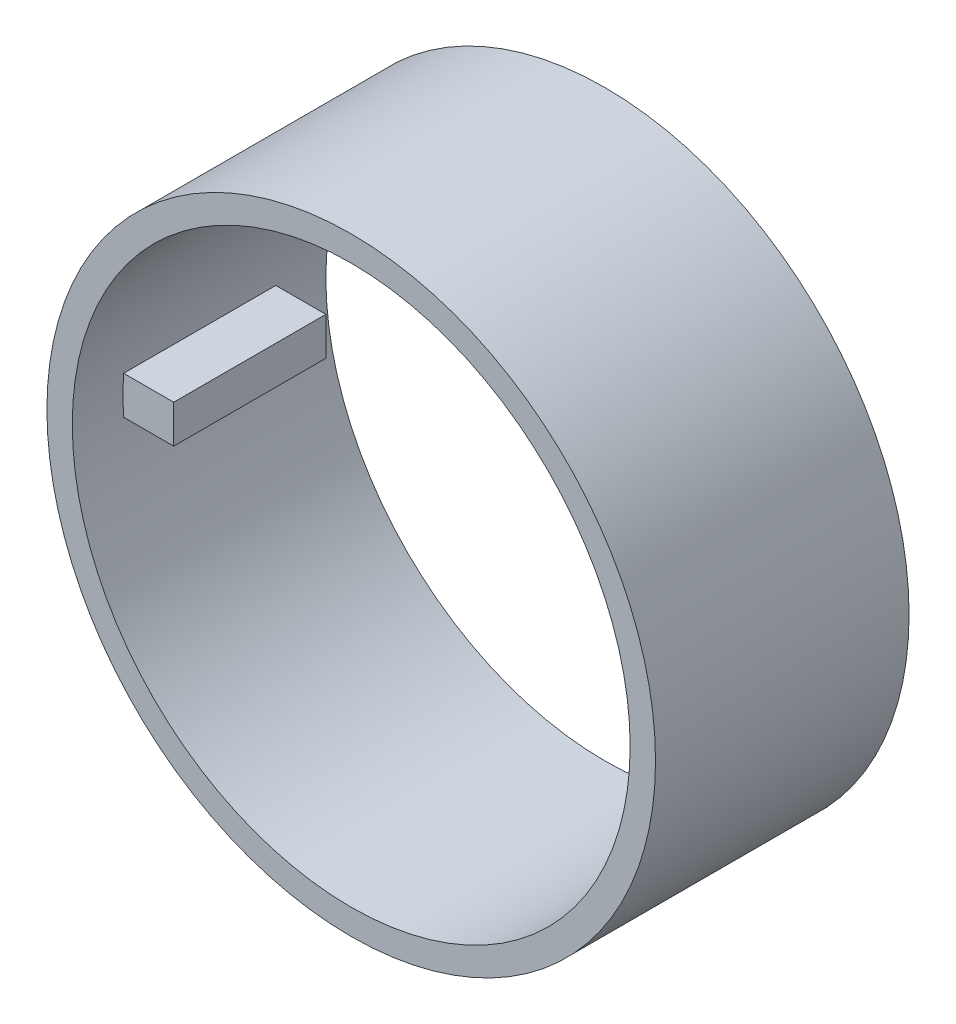
ISO-10303-21;
HEADER;
FILE_DESCRIPTION(('STEP AP214'),'2;1');
FILE_NAME('part.step','',(''),(''),'','','');
FILE_SCHEMA(('AUTOMOTIVE_DESIGN { 1 0 10303 214 1 1 1 1 }'));
ENDSEC;
DATA;
#1=APPLICATION_CONTEXT('core data for automotive mechanical design processes');
#2=APPLICATION_PROTOCOL_DEFINITION('international standard','automotive_design',2000,#1);
#3=PRODUCT_CONTEXT('',#1,'mechanical');
#4=PRODUCT('Part','Part','',(#3));
#5=PRODUCT_RELATED_PRODUCT_CATEGORY('part','',(#4));
#6=PRODUCT_DEFINITION_FORMATION('','',#4);
#7=PRODUCT_DEFINITION_CONTEXT('part definition',#1,'design');
#8=PRODUCT_DEFINITION('design','',#6,#7);
#9=PRODUCT_DEFINITION_SHAPE('','',#8);
#10=(LENGTH_UNIT() NAMED_UNIT(*) SI_UNIT(.MILLI.,.METRE.));
#11=(NAMED_UNIT(*) PLANE_ANGLE_UNIT() SI_UNIT($,.RADIAN.));
#12=(NAMED_UNIT(*) SI_UNIT($,.STERADIAN.) SOLID_ANGLE_UNIT());
#13=UNCERTAINTY_MEASURE_WITH_UNIT(LENGTH_MEASURE(1.E-05),#10,'distance_accuracy_value','');
#14=(GEOMETRIC_REPRESENTATION_CONTEXT(3) GLOBAL_UNCERTAINTY_ASSIGNED_CONTEXT((#13)) GLOBAL_UNIT_ASSIGNED_CONTEXT((#10,
#11,#12)) REPRESENTATION_CONTEXT('',''));
#15=CARTESIAN_POINT('',(0.,0.,0.));
#16=DIRECTION('',(0.,0.,1.));
#17=DIRECTION('',(1.,0.,0.));
#18=AXIS2_PLACEMENT_3D('',#15,#16,#17);
#19=CARTESIAN_POINT('',(0.,0.,63.5));
#20=DIRECTION('',(0.,0.,1.));
#21=DIRECTION('',(1.,0.,0.));
#22=AXIS2_PLACEMENT_3D('',#19,#20,#21);
#23=PLANE('',#22);
#24=CARTESIAN_POINT('',(0.,0.,63.5));
#25=DIRECTION('',(0.,0.,1.));
#26=DIRECTION('',(1.,0.,0.));
#27=AXIS2_PLACEMENT_3D('',#24,#25,#26);
#28=CIRCLE('',#27,152.4);
#29=CARTESIAN_POINT('',(152.4,0.,63.5));
#30=VERTEX_POINT('',#29);
#31=EDGE_CURVE('E152',#30,#30,#28,.T.);
#32=ORIENTED_EDGE('',*,*,#31,.T.);
#33=EDGE_LOOP('',(#32));
#34=FACE_BOUND('',#33,.T.);
#35=CARTESIAN_POINT('',(0.,0.,63.5));
#36=DIRECTION('',(0.,0.,1.));
#37=DIRECTION('',(1.,0.,0.));
#38=AXIS2_PLACEMENT_3D('',#35,#36,#37);
#39=CIRCLE('',#38,139.7);
#40=CARTESIAN_POINT('',(139.7,0.,63.5));
#41=VERTEX_POINT('',#40);
#42=EDGE_CURVE('E146',#41,#41,#39,.T.);
#43=ORIENTED_EDGE('',*,*,#42,.F.);
#44=EDGE_LOOP('',(#43));
#45=FACE_BOUND('',#44,.T.);
#46=ADVANCED_FACE('F32',(#34,#45),#23,.T.);
#47=CARTESIAN_POINT('',(0.,0.,-63.5));
#48=DIRECTION('',(0.,0.,1.));
#49=DIRECTION('',(1.,0.,0.));
#50=AXIS2_PLACEMENT_3D('',#47,#48,#49);
#51=PLANE('',#50);
#52=CARTESIAN_POINT('',(0.,0.,-63.5));
#53=DIRECTION('',(0.,0.,1.));
#54=DIRECTION('',(1.,0.,0.));
#55=AXIS2_PLACEMENT_3D('',#52,#53,#54);
#56=CIRCLE('',#55,152.4);
#57=CARTESIAN_POINT('',(152.4,0.,-63.5));
#58=VERTEX_POINT('',#57);
#59=EDGE_CURVE('E149',#58,#58,#56,.T.);
#60=ORIENTED_EDGE('',*,*,#59,.F.);
#61=EDGE_LOOP('',(#60));
#62=FACE_BOUND('',#61,.T.);
#63=CARTESIAN_POINT('',(0.,0.,-63.5));
#64=DIRECTION('',(0.,0.,1.));
#65=DIRECTION('',(1.,0.,0.));
#66=AXIS2_PLACEMENT_3D('',#63,#64,#65);
#67=CIRCLE('',#66,139.7);
#68=CARTESIAN_POINT('',(139.7,0.,-63.5));
#69=VERTEX_POINT('',#68);
#70=EDGE_CURVE('E145',#69,#69,#67,.T.);
#71=ORIENTED_EDGE('',*,*,#70,.T.);
#72=EDGE_LOOP('',(#71));
#73=FACE_BOUND('',#72,.T.);
#74=ADVANCED_FACE('F188',(#62,#73),#51,.F.);
#75=CARTESIAN_POINT('',(0.,0.,63.5));
#76=DIRECTION('',(0.,0.,-1.));
#77=DIRECTION('',(-1.,0.,0.));
#78=AXIS2_PLACEMENT_3D('',#75,#76,#77);
#79=CYLINDRICAL_SURFACE('',#78,152.4);
#80=ORIENTED_EDGE('',*,*,#31,.F.);
#81=EDGE_LOOP('',(#80));
#82=FACE_BOUND('',#81,.T.);
#83=ORIENTED_EDGE('',*,*,#59,.T.);
#84=EDGE_LOOP('',(#83));
#85=FACE_BOUND('',#84,.T.);
#86=ADVANCED_FACE('F34',(#82,#85),#79,.T.);
#87=CARTESIAN_POINT('',(0.,0.,63.5));
#88=DIRECTION('',(0.,0.,-1.));
#89=DIRECTION('',(-1.,0.,0.));
#90=AXIS2_PLACEMENT_3D('',#87,#88,#89);
#91=CYLINDRICAL_SURFACE('',#90,139.7);
#92=CARTESIAN_POINT('',(0.,0.,38.1));
#93=DIRECTION('',(0.,0.,1.));
#94=DIRECTION('',(1.,0.,0.));
#95=AXIS2_PLACEMENT_3D('',#92,#93,#94);
#96=CIRCLE('',#95,139.7);
#97=CARTESIAN_POINT('',(139.374905829565,-9.525,38.1));
#98=VERTEX_POINT('',#97);
#99=CARTESIAN_POINT('',(139.374905829565,9.525,38.1));
#100=VERTEX_POINT('',#99);
#101=EDGE_CURVE('E11',#98,#100,#96,.T.);
#102=ORIENTED_EDGE('',*,*,#101,.F.);
#103=DIRECTION('',(0.,0.,-1.));
#104=VECTOR('',#103,1.);
#105=CARTESIAN_POINT('',(139.374905829565,-9.525,63.5));
#106=LINE('',#105,#104);
#107=CARTESIAN_POINT('',(139.374905829565,-9.525,-38.1));
#108=VERTEX_POINT('',#107);
#109=EDGE_CURVE('E171',#108,#98,#106,.F.);
#110=ORIENTED_EDGE('',*,*,#109,.F.);
#111=CARTESIAN_POINT('',(0.,0.,-38.1));
#112=DIRECTION('',(0.,0.,1.));
#113=DIRECTION('',(1.,0.,0.));
#114=AXIS2_PLACEMENT_3D('',#111,#112,#113);
#115=CIRCLE('',#114,139.7);
#116=CARTESIAN_POINT('',(139.374905829565,9.525,-38.1));
#117=VERTEX_POINT('',#116);
#118=EDGE_CURVE('E168',#108,#117,#115,.T.);
#119=ORIENTED_EDGE('',*,*,#118,.T.);
#120=DIRECTION('',(0.,0.,-1.));
#121=VECTOR('',#120,1.);
#122=CARTESIAN_POINT('',(139.374905829565,9.525,63.5));
#123=LINE('',#122,#121);
#124=EDGE_CURVE('E40',#100,#117,#123,.T.);
#125=ORIENTED_EDGE('',*,*,#124,.F.);
#126=EDGE_LOOP('',(#102,#110,#119,#125));
#127=FACE_BOUND('',#126,.T.);
#128=CARTESIAN_POINT('',(0.,0.,38.1));
#129=DIRECTION('',(0.,0.,1.));
#130=DIRECTION('',(1.,0.,0.));
#131=AXIS2_PLACEMENT_3D('',#128,#129,#130);
#132=CIRCLE('',#131,139.7);
#133=CARTESIAN_POINT('',(-139.374905829565,9.525,38.1));
#134=VERTEX_POINT('',#133);
#135=CARTESIAN_POINT('',(-139.374905829565,-9.525,38.1));
#136=VERTEX_POINT('',#135);
#137=EDGE_CURVE('E166',#134,#136,#132,.T.);
#138=ORIENTED_EDGE('',*,*,#137,.F.);
#139=DIRECTION('',(0.,0.,-1.));
#140=VECTOR('',#139,1.);
#141=CARTESIAN_POINT('',(-139.374905829565,9.525,63.5));
#142=LINE('',#141,#140);
#143=CARTESIAN_POINT('',(-139.374905829565,9.525,-38.1));
#144=VERTEX_POINT('',#143);
#145=EDGE_CURVE('E160',#134,#144,#142,.T.);
#146=ORIENTED_EDGE('',*,*,#145,.T.);
#147=CARTESIAN_POINT('',(0.,0.,-38.1));
#148=DIRECTION('',(0.,0.,1.));
#149=DIRECTION('',(1.,0.,0.));
#150=AXIS2_PLACEMENT_3D('',#147,#148,#149);
#151=CIRCLE('',#150,139.7);
#152=CARTESIAN_POINT('',(-139.374905829565,-9.525,-38.1));
#153=VERTEX_POINT('',#152);
#154=EDGE_CURVE('E155',#144,#153,#151,.T.);
#155=ORIENTED_EDGE('',*,*,#154,.T.);
#156=DIRECTION('',(0.,0.,-1.));
#157=VECTOR('',#156,1.);
#158=CARTESIAN_POINT('',(-139.374905829565,-9.525,63.5));
#159=LINE('',#158,#157);
#160=EDGE_CURVE('E163',#153,#136,#159,.F.);
#161=ORIENTED_EDGE('',*,*,#160,.T.);
#162=EDGE_LOOP('',(#138,#146,#155,#161));
#163=FACE_BOUND('',#162,.T.);
#164=ORIENTED_EDGE('',*,*,#42,.T.);
#165=EDGE_LOOP('',(#164));
#166=FACE_BOUND('',#165,.T.);
#167=ORIENTED_EDGE('',*,*,#70,.F.);
#168=EDGE_LOOP('',(#167));
#169=FACE_BOUND('',#168,.T.);
#170=ADVANCED_FACE('F174',(#127,#163,#166,#169),#91,.F.);
#171=CARTESIAN_POINT('',(0.,0.,38.1));
#172=DIRECTION('',(0.,0.,1.));
#173=DIRECTION('',(1.,0.,0.));
#174=AXIS2_PLACEMENT_3D('',#171,#172,#173);
#175=PLANE('',#174);
#176=DIRECTION('',(-1.,0.,0.));
#177=VECTOR('',#176,1.);
#178=CARTESIAN_POINT('',(-149.225,9.525,38.1));
#179=LINE('',#178,#177);
#180=CARTESIAN_POINT('',(-114.3,9.525,38.1));
#181=VERTEX_POINT('',#180);
#182=EDGE_CURVE('E131',#181,#134,#179,.T.);
#183=ORIENTED_EDGE('',*,*,#182,.T.);
#184=ORIENTED_EDGE('',*,*,#137,.T.);
#185=DIRECTION('',(1.,0.,0.));
#186=VECTOR('',#185,1.);
#187=CARTESIAN_POINT('',(-149.225,-9.525,38.1));
#188=LINE('',#187,#186);
#189=CARTESIAN_POINT('',(-114.3,-9.525,38.1));
#190=VERTEX_POINT('',#189);
#191=EDGE_CURVE('E126',#136,#190,#188,.T.);
#192=ORIENTED_EDGE('',*,*,#191,.T.);
#193=DIRECTION('',(0.,1.,0.));
#194=VECTOR('',#193,1.);
#195=CARTESIAN_POINT('',(-114.3,9.525,38.1));
#196=LINE('',#195,#194);
#197=EDGE_CURVE('E128',#190,#181,#196,.T.);
#198=ORIENTED_EDGE('',*,*,#197,.T.);
#199=EDGE_LOOP('',(#183,#184,#192,#198));
#200=FACE_BOUND('',#199,.T.);
#201=ADVANCED_FACE('F199',(#200),#175,.T.);
#202=CARTESIAN_POINT('',(0.,0.,-38.1));
#203=DIRECTION('',(0.,0.,1.));
#204=DIRECTION('',(1.,0.,0.));
#205=AXIS2_PLACEMENT_3D('',#202,#203,#204);
#206=PLANE('',#205);
#207=ORIENTED_EDGE('',*,*,#154,.F.);
#208=DIRECTION('',(-1.,0.,0.));
#209=VECTOR('',#208,1.);
#210=CARTESIAN_POINT('',(-149.225,9.525,-38.1));
#211=LINE('',#210,#209);
#212=CARTESIAN_POINT('',(-114.3,9.525,-38.1));
#213=VERTEX_POINT('',#212);
#214=EDGE_CURVE('E129',#213,#144,#211,.T.);
#215=ORIENTED_EDGE('',*,*,#214,.F.);
#216=DIRECTION('',(0.,1.,0.));
#217=VECTOR('',#216,1.);
#218=CARTESIAN_POINT('',(-114.3,9.525,-38.1));
#219=LINE('',#218,#217);
#220=CARTESIAN_POINT('',(-114.3,-9.525,-38.1));
#221=VERTEX_POINT('',#220);
#222=EDGE_CURVE('E136',#221,#213,#219,.T.);
#223=ORIENTED_EDGE('',*,*,#222,.F.);
#224=DIRECTION('',(1.,0.,0.));
#225=VECTOR('',#224,1.);
#226=CARTESIAN_POINT('',(-149.225,-9.525,-38.1));
#227=LINE('',#226,#225);
#228=EDGE_CURVE('E55',#153,#221,#227,.T.);
#229=ORIENTED_EDGE('',*,*,#228,.F.);
#230=EDGE_LOOP('',(#207,#215,#223,#229));
#231=FACE_BOUND('',#230,.T.);
#232=ADVANCED_FACE('F204',(#231),#206,.F.);
#233=CARTESIAN_POINT('',(-149.225,-9.525,38.1));
#234=DIRECTION('',(0.,1.,0.));
#235=DIRECTION('',(0.,0.,1.));
#236=AXIS2_PLACEMENT_3D('',#233,#234,#235);
#237=PLANE('',#236);
#238=ORIENTED_EDGE('',*,*,#160,.F.);
#239=ORIENTED_EDGE('',*,*,#228,.T.);
#240=DIRECTION('',(0.,0.,-1.));
#241=VECTOR('',#240,1.);
#242=CARTESIAN_POINT('',(-114.3,-9.525,38.1));
#243=LINE('',#242,#241);
#244=EDGE_CURVE('E142',#190,#221,#243,.T.);
#245=ORIENTED_EDGE('',*,*,#244,.F.);
#246=ORIENTED_EDGE('',*,*,#191,.F.);
#247=EDGE_LOOP('',(#238,#239,#245,#246));
#248=FACE_BOUND('',#247,.T.);
#249=ADVANCED_FACE('F200',(#248),#237,.F.);
#250=CARTESIAN_POINT('',(-114.3,9.525,38.1));
#251=DIRECTION('',(-1.,0.,0.));
#252=DIRECTION('',(0.,0.,1.));
#253=AXIS2_PLACEMENT_3D('',#250,#251,#252);
#254=PLANE('',#253);
#255=ORIENTED_EDGE('',*,*,#222,.T.);
#256=DIRECTION('',(0.,0.,-1.));
#257=VECTOR('',#256,1.);
#258=CARTESIAN_POINT('',(-114.3,9.525,38.1));
#259=LINE('',#258,#257);
#260=EDGE_CURVE('E134',#181,#213,#259,.T.);
#261=ORIENTED_EDGE('',*,*,#260,.F.);
#262=ORIENTED_EDGE('',*,*,#197,.F.);
#263=ORIENTED_EDGE('',*,*,#244,.T.);
#264=EDGE_LOOP('',(#255,#261,#262,#263));
#265=FACE_BOUND('',#264,.T.);
#266=ADVANCED_FACE('F203',(#265),#254,.F.);
#267=CARTESIAN_POINT('',(-149.225,9.525,38.1));
#268=DIRECTION('',(0.,-1.,0.));
#269=DIRECTION('',(0.,0.,-1.));
#270=AXIS2_PLACEMENT_3D('',#267,#268,#269);
#271=PLANE('',#270);
#272=ORIENTED_EDGE('',*,*,#145,.F.);
#273=ORIENTED_EDGE('',*,*,#182,.F.);
#274=ORIENTED_EDGE('',*,*,#260,.T.);
#275=ORIENTED_EDGE('',*,*,#214,.T.);
#276=EDGE_LOOP('',(#272,#273,#274,#275));
#277=FACE_BOUND('',#276,.T.);
#278=ADVANCED_FACE('F208',(#277),#271,.F.);
#279=CARTESIAN_POINT('',(0.,0.,38.1));
#280=DIRECTION('',(0.,0.,1.));
#281=DIRECTION('',(-1.,0.,0.));
#282=AXIS2_PLACEMENT_3D('',#279,#280,#281);
#283=PLANE('',#282);
#284=DIRECTION('',(-1.,0.,0.));
#285=VECTOR('',#284,1.);
#286=CARTESIAN_POINT('',(149.225,-9.525,38.1));
#287=LINE('',#286,#285);
#288=CARTESIAN_POINT('',(114.3,-9.525,38.1));
#289=VERTEX_POINT('',#288);
#290=EDGE_CURVE('E117',#98,#289,#287,.T.);
#291=ORIENTED_EDGE('',*,*,#290,.F.);
#292=ORIENTED_EDGE('',*,*,#101,.T.);
#293=DIRECTION('',(1.,0.,0.));
#294=VECTOR('',#293,1.);
#295=CARTESIAN_POINT('',(149.225,9.525,38.1));
#296=LINE('',#295,#294);
#297=CARTESIAN_POINT('',(114.3,9.525,38.1));
#298=VERTEX_POINT('',#297);
#299=EDGE_CURVE('E99',#298,#100,#296,.T.);
#300=ORIENTED_EDGE('',*,*,#299,.F.);
#301=DIRECTION('',(0.,1.,0.));
#302=VECTOR('',#301,1.);
#303=CARTESIAN_POINT('',(114.3,9.525,38.1));
#304=LINE('',#303,#302);
#305=EDGE_CURVE('E110',#289,#298,#304,.T.);
#306=ORIENTED_EDGE('',*,*,#305,.F.);
#307=EDGE_LOOP('',(#291,#292,#300,#306));
#308=FACE_BOUND('',#307,.T.);
#309=ADVANCED_FACE('F109',(#308),#283,.T.);
#310=CARTESIAN_POINT('',(0.,0.,-38.1));
#311=DIRECTION('',(0.,0.,1.));
#312=DIRECTION('',(-1.,0.,0.));
#313=AXIS2_PLACEMENT_3D('',#310,#311,#312);
#314=PLANE('',#313);
#315=ORIENTED_EDGE('',*,*,#118,.F.);
#316=DIRECTION('',(-1.,0.,0.));
#317=VECTOR('',#316,1.);
#318=CARTESIAN_POINT('',(149.225,-9.525,-38.1));
#319=LINE('',#318,#317);
#320=CARTESIAN_POINT('',(114.3,-9.525,-38.1));
#321=VERTEX_POINT('',#320);
#322=EDGE_CURVE('E112',#108,#321,#319,.T.);
#323=ORIENTED_EDGE('',*,*,#322,.T.);
#324=DIRECTION('',(0.,1.,0.));
#325=VECTOR('',#324,1.);
#326=CARTESIAN_POINT('',(114.3,9.525,-38.1));
#327=LINE('',#326,#325);
#328=CARTESIAN_POINT('',(114.3,9.525,-38.1));
#329=VERTEX_POINT('',#328);
#330=EDGE_CURVE('E122',#321,#329,#327,.T.);
#331=ORIENTED_EDGE('',*,*,#330,.T.);
#332=DIRECTION('',(1.,0.,0.));
#333=VECTOR('',#332,1.);
#334=CARTESIAN_POINT('',(149.225,9.525,-38.1));
#335=LINE('',#334,#333);
#336=EDGE_CURVE('E47',#329,#117,#335,.T.);
#337=ORIENTED_EDGE('',*,*,#336,.T.);
#338=EDGE_LOOP('',(#315,#323,#331,#337));
#339=FACE_BOUND('',#338,.T.);
#340=ADVANCED_FACE('F177',(#339),#314,.F.);
#341=CARTESIAN_POINT('',(149.225,9.525,38.1));
#342=DIRECTION('',(0.,1.,0.));
#343=DIRECTION('',(0.,0.,1.));
#344=AXIS2_PLACEMENT_3D('',#341,#342,#343);
#345=PLANE('',#344);
#346=ORIENTED_EDGE('',*,*,#299,.T.);
#347=ORIENTED_EDGE('',*,*,#124,.T.);
#348=ORIENTED_EDGE('',*,*,#336,.F.);
#349=DIRECTION('',(0.,0.,-1.));
#350=VECTOR('',#349,1.);
#351=CARTESIAN_POINT('',(114.3,9.525,38.1));
#352=LINE('',#351,#350);
#353=EDGE_CURVE('E96',#298,#329,#352,.T.);
#354=ORIENTED_EDGE('',*,*,#353,.F.);
#355=EDGE_LOOP('',(#346,#347,#348,#354));
#356=FACE_BOUND('',#355,.T.);
#357=ADVANCED_FACE('F98',(#356),#345,.T.);
#358=CARTESIAN_POINT('',(114.3,9.525,38.1));
#359=DIRECTION('',(-1.,0.,0.));
#360=DIRECTION('',(0.,0.,1.));
#361=AXIS2_PLACEMENT_3D('',#358,#359,#360);
#362=PLANE('',#361);
#363=ORIENTED_EDGE('',*,*,#330,.F.);
#364=DIRECTION('',(0.,0.,-1.));
#365=VECTOR('',#364,1.);
#366=CARTESIAN_POINT('',(114.3,-9.525,38.1));
#367=LINE('',#366,#365);
#368=EDGE_CURVE('E104',#289,#321,#367,.T.);
#369=ORIENTED_EDGE('',*,*,#368,.F.);
#370=ORIENTED_EDGE('',*,*,#305,.T.);
#371=ORIENTED_EDGE('',*,*,#353,.T.);
#372=EDGE_LOOP('',(#363,#369,#370,#371));
#373=FACE_BOUND('',#372,.T.);
#374=ADVANCED_FACE('F115',(#373),#362,.T.);
#375=CARTESIAN_POINT('',(149.225,-9.525,38.1));
#376=DIRECTION('',(0.,-1.,0.));
#377=DIRECTION('',(0.,0.,-1.));
#378=AXIS2_PLACEMENT_3D('',#375,#376,#377);
#379=PLANE('',#378);
#380=ORIENTED_EDGE('',*,*,#322,.F.);
#381=ORIENTED_EDGE('',*,*,#109,.T.);
#382=ORIENTED_EDGE('',*,*,#290,.T.);
#383=ORIENTED_EDGE('',*,*,#368,.T.);
#384=EDGE_LOOP('',(#380,#381,#382,#383));
#385=FACE_BOUND('',#384,.T.);
#386=ADVANCED_FACE('F179',(#385),#379,.T.);
#387=CLOSED_SHELL('',(#46,#74,#86,#170,#201,#232,#249,#266,#278,#309,#340,#357,#374,#386));
#388=MANIFOLD_SOLID_BREP('B2',#387);
#389=ADVANCED_BREP_SHAPE_REPRESENTATION('',(#18,#388),#14);
#390=SHAPE_DEFINITION_REPRESENTATION(#9,#389);
ENDSEC;
END-ISO-10303-21;
